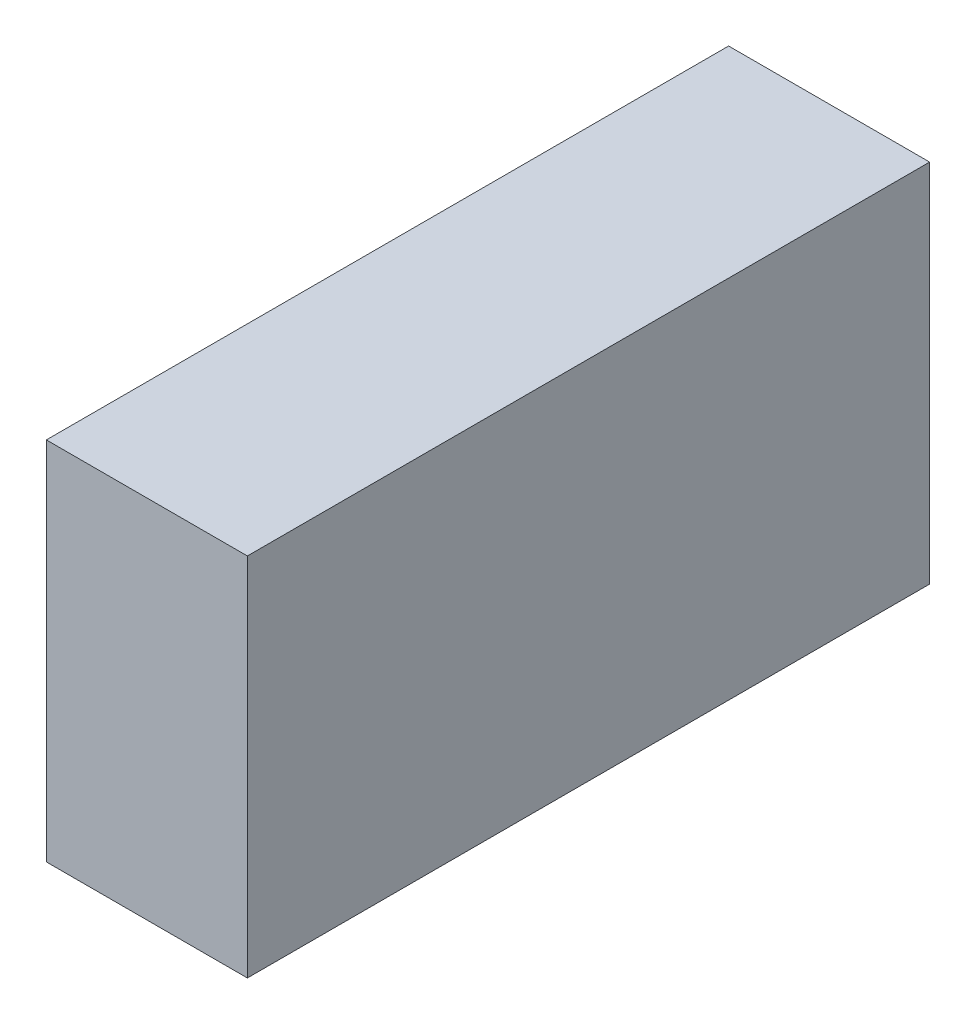
ISO-10303-21;
HEADER;
FILE_DESCRIPTION(('STEP AP214'),'2;1');
FILE_NAME('part.step','',(''),(''),'','','');
FILE_SCHEMA(('AUTOMOTIVE_DESIGN { 1 0 10303 214 1 1 1 1 }'));
ENDSEC;
DATA;
#1=APPLICATION_CONTEXT('core data for automotive mechanical design processes');
#2=APPLICATION_PROTOCOL_DEFINITION('international standard','automotive_design',2000,#1);
#3=PRODUCT_CONTEXT('',#1,'mechanical');
#4=PRODUCT('Part','Part','',(#3));
#5=PRODUCT_RELATED_PRODUCT_CATEGORY('part','',(#4));
#6=PRODUCT_DEFINITION_FORMATION('','',#4);
#7=PRODUCT_DEFINITION_CONTEXT('part definition',#1,'design');
#8=PRODUCT_DEFINITION('design','',#6,#7);
#9=PRODUCT_DEFINITION_SHAPE('','',#8);
#10=(LENGTH_UNIT() NAMED_UNIT(*) SI_UNIT(.MILLI.,.METRE.));
#11=(NAMED_UNIT(*) PLANE_ANGLE_UNIT() SI_UNIT($,.RADIAN.));
#12=(NAMED_UNIT(*) SI_UNIT($,.STERADIAN.) SOLID_ANGLE_UNIT());
#13=UNCERTAINTY_MEASURE_WITH_UNIT(LENGTH_MEASURE(1.E-05),#10,'distance_accuracy_value','');
#14=(GEOMETRIC_REPRESENTATION_CONTEXT(3) GLOBAL_UNCERTAINTY_ASSIGNED_CONTEXT((#13)) GLOBAL_UNIT_ASSIGNED_CONTEXT((#10,
#11,#12)) REPRESENTATION_CONTEXT('',''));
#15=CARTESIAN_POINT('',(0.,0.,0.));
#16=DIRECTION('',(0.,0.,1.));
#17=DIRECTION('',(1.,0.,0.));
#18=AXIS2_PLACEMENT_3D('',#15,#16,#17);
#19=CARTESIAN_POINT('',(8.25,15.,56.));
#20=DIRECTION('',(0.,-1.,0.));
#21=DIRECTION('',(0.,0.,-1.));
#22=AXIS2_PLACEMENT_3D('',#19,#20,#21);
#23=PLANE('',#22);
#24=DIRECTION('',(-1.,0.,0.));
#25=VECTOR('',#24,1.);
#26=CARTESIAN_POINT('',(8.25,15.,0.));
#27=LINE('',#26,#25);
#28=CARTESIAN_POINT('',(8.25,15.,0.));
#29=VERTEX_POINT('',#28);
#30=CARTESIAN_POINT('',(-8.25,15.,0.));
#31=VERTEX_POINT('',#30);
#32=EDGE_CURVE('E102',#29,#31,#27,.T.);
#33=ORIENTED_EDGE('',*,*,#32,.T.);
#34=DIRECTION('',(0.,0.,-1.));
#35=VECTOR('',#34,1.);
#36=CARTESIAN_POINT('',(-8.25,15.,56.));
#37=LINE('',#36,#35);
#38=CARTESIAN_POINT('',(-8.25,15.,56.));
#39=VERTEX_POINT('',#38);
#40=EDGE_CURVE('E11',#39,#31,#37,.T.);
#41=ORIENTED_EDGE('',*,*,#40,.F.);
#42=DIRECTION('',(-1.,0.,0.));
#43=VECTOR('',#42,1.);
#44=CARTESIAN_POINT('',(8.25,15.,56.));
#45=LINE('',#44,#43);
#46=CARTESIAN_POINT('',(8.25,15.,56.));
#47=VERTEX_POINT('',#46);
#48=EDGE_CURVE('E90',#47,#39,#45,.T.);
#49=ORIENTED_EDGE('',*,*,#48,.F.);
#50=DIRECTION('',(0.,0.,-1.));
#51=VECTOR('',#50,1.);
#52=CARTESIAN_POINT('',(8.25,15.,56.));
#53=LINE('',#52,#51);
#54=EDGE_CURVE('E98',#47,#29,#53,.T.);
#55=ORIENTED_EDGE('',*,*,#54,.T.);
#56=EDGE_LOOP('',(#33,#41,#49,#55));
#57=FACE_BOUND('',#56,.T.);
#58=ADVANCED_FACE('F39',(#57),#23,.F.);
#59=CARTESIAN_POINT('',(-8.25,-15.,56.));
#60=DIRECTION('',(1.,0.,0.));
#61=DIRECTION('',(0.,0.,-1.));
#62=AXIS2_PLACEMENT_3D('',#59,#60,#61);
#63=PLANE('',#62);
#64=DIRECTION('',(0.,-1.,0.));
#65=VECTOR('',#64,1.);
#66=CARTESIAN_POINT('',(-8.25,-15.,0.));
#67=LINE('',#66,#65);
#68=CARTESIAN_POINT('',(-8.25,-15.,0.));
#69=VERTEX_POINT('',#68);
#70=EDGE_CURVE('E94',#31,#69,#67,.T.);
#71=ORIENTED_EDGE('',*,*,#70,.T.);
#72=DIRECTION('',(0.,0.,-1.));
#73=VECTOR('',#72,1.);
#74=CARTESIAN_POINT('',(-8.25,-15.,56.));
#75=LINE('',#74,#73);
#76=CARTESIAN_POINT('',(-8.25,-15.,56.));
#77=VERTEX_POINT('',#76);
#78=EDGE_CURVE('E47',#77,#69,#75,.T.);
#79=ORIENTED_EDGE('',*,*,#78,.F.);
#80=DIRECTION('',(0.,-1.,0.));
#81=VECTOR('',#80,1.);
#82=CARTESIAN_POINT('',(-8.25,-15.,56.));
#83=LINE('',#82,#81);
#84=EDGE_CURVE('E85',#39,#77,#83,.T.);
#85=ORIENTED_EDGE('',*,*,#84,.F.);
#86=ORIENTED_EDGE('',*,*,#40,.T.);
#87=EDGE_LOOP('',(#71,#79,#85,#86));
#88=FACE_BOUND('',#87,.T.);
#89=ADVANCED_FACE('F93',(#88),#63,.F.);
#90=CARTESIAN_POINT('',(8.25,-15.,56.));
#91=DIRECTION('',(0.,1.,0.));
#92=DIRECTION('',(0.,0.,1.));
#93=AXIS2_PLACEMENT_3D('',#90,#91,#92);
#94=PLANE('',#93);
#95=DIRECTION('',(1.,0.,0.));
#96=VECTOR('',#95,1.);
#97=CARTESIAN_POINT('',(8.25,-15.,0.));
#98=LINE('',#97,#96);
#99=CARTESIAN_POINT('',(8.25,-15.,0.));
#100=VERTEX_POINT('',#99);
#101=EDGE_CURVE('E72',#69,#100,#98,.T.);
#102=ORIENTED_EDGE('',*,*,#101,.T.);
#103=DIRECTION('',(0.,0.,-1.));
#104=VECTOR('',#103,1.);
#105=CARTESIAN_POINT('',(8.25,-15.,56.));
#106=LINE('',#105,#104);
#107=CARTESIAN_POINT('',(8.25,-15.,56.));
#108=VERTEX_POINT('',#107);
#109=EDGE_CURVE('E95',#108,#100,#106,.T.);
#110=ORIENTED_EDGE('',*,*,#109,.F.);
#111=DIRECTION('',(1.,0.,0.));
#112=VECTOR('',#111,1.);
#113=CARTESIAN_POINT('',(8.25,-15.,56.));
#114=LINE('',#113,#112);
#115=EDGE_CURVE('E88',#77,#108,#114,.T.);
#116=ORIENTED_EDGE('',*,*,#115,.F.);
#117=ORIENTED_EDGE('',*,*,#78,.T.);
#118=EDGE_LOOP('',(#102,#110,#116,#117));
#119=FACE_BOUND('',#118,.T.);
#120=ADVANCED_FACE('F96',(#119),#94,.F.);
#121=CARTESIAN_POINT('',(8.25,-15.,56.));
#122=DIRECTION('',(-1.,0.,0.));
#123=DIRECTION('',(0.,0.,1.));
#124=AXIS2_PLACEMENT_3D('',#121,#122,#123);
#125=PLANE('',#124);
#126=DIRECTION('',(0.,1.,0.));
#127=VECTOR('',#126,1.);
#128=CARTESIAN_POINT('',(8.25,-15.,0.));
#129=LINE('',#128,#127);
#130=EDGE_CURVE('E78',#100,#29,#129,.T.);
#131=ORIENTED_EDGE('',*,*,#130,.T.);
#132=ORIENTED_EDGE('',*,*,#54,.F.);
#133=DIRECTION('',(0.,1.,0.));
#134=VECTOR('',#133,1.);
#135=CARTESIAN_POINT('',(8.25,-15.,56.));
#136=LINE('',#135,#134);
#137=EDGE_CURVE('E55',#108,#47,#136,.T.);
#138=ORIENTED_EDGE('',*,*,#137,.F.);
#139=ORIENTED_EDGE('',*,*,#109,.T.);
#140=EDGE_LOOP('',(#131,#132,#138,#139));
#141=FACE_BOUND('',#140,.T.);
#142=ADVANCED_FACE('F109',(#141),#125,.F.);
#143=CARTESIAN_POINT('',(0.,0.,56.));
#144=DIRECTION('',(0.,0.,-1.));
#145=DIRECTION('',(-1.,0.,0.));
#146=AXIS2_PLACEMENT_3D('',#143,#144,#145);
#147=PLANE('',#146);
#148=ORIENTED_EDGE('',*,*,#48,.T.);
#149=ORIENTED_EDGE('',*,*,#84,.T.);
#150=ORIENTED_EDGE('',*,*,#115,.T.);
#151=ORIENTED_EDGE('',*,*,#137,.T.);
#152=EDGE_LOOP('',(#148,#149,#150,#151));
#153=FACE_BOUND('',#152,.T.);
#154=ADVANCED_FACE('F86',(#153),#147,.F.);
#155=CARTESIAN_POINT('',(0.,0.,0.));
#156=DIRECTION('',(0.,0.,-1.));
#157=DIRECTION('',(-1.,0.,0.));
#158=AXIS2_PLACEMENT_3D('',#155,#156,#157);
#159=PLANE('',#158);
#160=ORIENTED_EDGE('',*,*,#32,.F.);
#161=ORIENTED_EDGE('',*,*,#130,.F.);
#162=ORIENTED_EDGE('',*,*,#101,.F.);
#163=ORIENTED_EDGE('',*,*,#70,.F.);
#164=EDGE_LOOP('',(#160,#161,#162,#163));
#165=FACE_BOUND('',#164,.T.);
#166=ADVANCED_FACE('F112',(#165),#159,.T.);
#167=CLOSED_SHELL('',(#58,#89,#120,#142,#154,#166));
#168=MANIFOLD_SOLID_BREP('B2',#167);
#169=ADVANCED_BREP_SHAPE_REPRESENTATION('',(#18,#168),#14);
#170=SHAPE_DEFINITION_REPRESENTATION(#9,#169);
ENDSEC;
END-ISO-10303-21;
